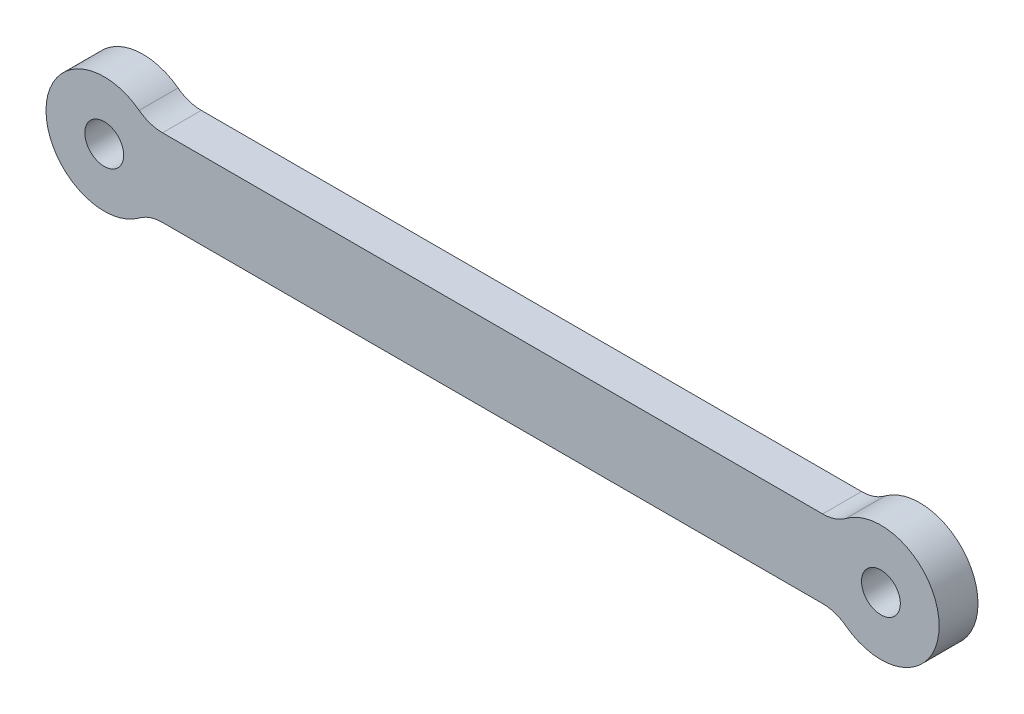
ISO-10303-21;
HEADER;
FILE_DESCRIPTION(('STEP AP214'),'2;1');
FILE_NAME('part.step','',(''),(''),'','','');
FILE_SCHEMA(('AUTOMOTIVE_DESIGN { 1 0 10303 214 1 1 1 1 }'));
ENDSEC;
DATA;
#1=APPLICATION_CONTEXT('core data for automotive mechanical design processes');
#2=APPLICATION_PROTOCOL_DEFINITION('international standard','automotive_design',2000,#1);
#3=PRODUCT_CONTEXT('',#1,'mechanical');
#4=PRODUCT('Part','Part','',(#3));
#5=PRODUCT_RELATED_PRODUCT_CATEGORY('part','',(#4));
#6=PRODUCT_DEFINITION_FORMATION('','',#4);
#7=PRODUCT_DEFINITION_CONTEXT('part definition',#1,'design');
#8=PRODUCT_DEFINITION('design','',#6,#7);
#9=PRODUCT_DEFINITION_SHAPE('','',#8);
#10=(LENGTH_UNIT() NAMED_UNIT(*) SI_UNIT(.MILLI.,.METRE.));
#11=(NAMED_UNIT(*) PLANE_ANGLE_UNIT() SI_UNIT($,.RADIAN.));
#12=(NAMED_UNIT(*) SI_UNIT($,.STERADIAN.) SOLID_ANGLE_UNIT());
#13=UNCERTAINTY_MEASURE_WITH_UNIT(LENGTH_MEASURE(1.E-05),#10,'distance_accuracy_value','');
#14=(GEOMETRIC_REPRESENTATION_CONTEXT(3) GLOBAL_UNCERTAINTY_ASSIGNED_CONTEXT((#13)) GLOBAL_UNIT_ASSIGNED_CONTEXT((#10,
#11,#12)) REPRESENTATION_CONTEXT('',''));
#15=CARTESIAN_POINT('',(0.,0.,0.));
#16=DIRECTION('',(0.,0.,1.));
#17=DIRECTION('',(1.,0.,0.));
#18=AXIS2_PLACEMENT_3D('',#15,#16,#17);
#19=CARTESIAN_POINT('',(-117.475,-12.7,3.175));
#20=DIRECTION('',(0.,0.,1.));
#21=DIRECTION('',(1.,0.,0.));
#22=AXIS2_PLACEMENT_3D('',#19,#20,#21);
#23=PLANE('',#22);
#24=CARTESIAN_POINT('',(0.,0.,3.175));
#25=DIRECTION('',(0.,0.,1.));
#26=DIRECTION('',(1.,0.,0.));
#27=AXIS2_PLACEMENT_3D('',#24,#25,#26);
#28=CIRCLE('',#27,3.175);
#29=CARTESIAN_POINT('',(3.175,0.,3.175));
#30=VERTEX_POINT('',#29);
#31=EDGE_CURVE('E134',#30,#30,#28,.T.);
#32=ORIENTED_EDGE('',*,*,#31,.F.);
#33=EDGE_LOOP('',(#32));
#34=FACE_BOUND('',#33,.T.);
#35=CARTESIAN_POINT('',(-117.475,-12.7,3.175));
#36=DIRECTION('',(0.,0.,-1.));
#37=DIRECTION('',(1.,0.,0.));
#38=AXIS2_PLACEMENT_3D('',#35,#36,#37);
#39=CIRCLE('',#38,6.35);
#40=CARTESIAN_POINT('',(-121.285,-7.62,3.175));
#41=VERTEX_POINT('',#40);
#42=CARTESIAN_POINT('',(-117.475,-6.35,3.175));
#43=VERTEX_POINT('',#42);
#44=EDGE_CURVE('E145',#41,#43,#39,.T.);
#45=ORIENTED_EDGE('',*,*,#44,.T.);
#46=DIRECTION('',(1.,0.,0.));
#47=VECTOR('',#46,1.);
#48=CARTESIAN_POINT('',(-9.525,-6.35,3.175));
#49=LINE('',#48,#47);
#50=CARTESIAN_POINT('',(-9.525,-6.35,3.175));
#51=VERTEX_POINT('',#50);
#52=EDGE_CURVE('E93',#43,#51,#49,.T.);
#53=ORIENTED_EDGE('',*,*,#52,.T.);
#54=CARTESIAN_POINT('',(-9.525,-12.7,3.175));
#55=DIRECTION('',(0.,0.,-1.));
#56=DIRECTION('',(-1.,0.,0.));
#57=AXIS2_PLACEMENT_3D('',#54,#55,#56);
#58=CIRCLE('',#57,6.35);
#59=CARTESIAN_POINT('',(-5.715,-7.62,3.175));
#60=VERTEX_POINT('',#59);
#61=EDGE_CURVE('E160',#51,#60,#58,.T.);
#62=ORIENTED_EDGE('',*,*,#61,.T.);
#63=CARTESIAN_POINT('',(0.,0.,3.175));
#64=DIRECTION('',(0.,0.,1.));
#65=DIRECTION('',(1.,0.,0.));
#66=AXIS2_PLACEMENT_3D('',#63,#64,#65);
#67=CIRCLE('',#66,9.525);
#68=CARTESIAN_POINT('',(-5.715,7.62,3.175));
#69=VERTEX_POINT('',#68);
#70=EDGE_CURVE('E173',#60,#69,#67,.T.);
#71=ORIENTED_EDGE('',*,*,#70,.T.);
#72=CARTESIAN_POINT('',(-9.525,12.7,3.175));
#73=DIRECTION('',(0.,0.,-1.));
#74=DIRECTION('',(1.,0.,0.));
#75=AXIS2_PLACEMENT_3D('',#72,#73,#74);
#76=CIRCLE('',#75,6.35);
#77=CARTESIAN_POINT('',(-9.525,6.35,3.175));
#78=VERTEX_POINT('',#77);
#79=EDGE_CURVE('E112',#69,#78,#76,.T.);
#80=ORIENTED_EDGE('',*,*,#79,.T.);
#81=DIRECTION('',(-1.,0.,0.));
#82=VECTOR('',#81,1.);
#83=CARTESIAN_POINT('',(-117.475,6.35,3.175));
#84=LINE('',#83,#82);
#85=CARTESIAN_POINT('',(-117.475,6.35,3.175));
#86=VERTEX_POINT('',#85);
#87=EDGE_CURVE('E106',#78,#86,#84,.T.);
#88=ORIENTED_EDGE('',*,*,#87,.T.);
#89=CARTESIAN_POINT('',(-117.475,12.7,3.175));
#90=DIRECTION('',(0.,0.,-1.));
#91=DIRECTION('',(-1.,0.,0.));
#92=AXIS2_PLACEMENT_3D('',#89,#90,#91);
#93=CIRCLE('',#92,6.35);
#94=CARTESIAN_POINT('',(-121.285,7.62,3.175));
#95=VERTEX_POINT('',#94);
#96=EDGE_CURVE('E110',#86,#95,#93,.T.);
#97=ORIENTED_EDGE('',*,*,#96,.T.);
#98=CARTESIAN_POINT('',(-127.,0.,3.175));
#99=DIRECTION('',(0.,0.,1.));
#100=DIRECTION('',(1.,0.,0.));
#101=AXIS2_PLACEMENT_3D('',#98,#99,#100);
#102=CIRCLE('',#101,9.525);
#103=EDGE_CURVE('E50',#95,#41,#102,.T.);
#104=ORIENTED_EDGE('',*,*,#103,.T.);
#105=EDGE_LOOP('',(#45,#53,#62,#71,#80,#88,#97,#104));
#106=FACE_BOUND('',#105,.T.);
#107=CARTESIAN_POINT('',(-127.,0.,3.175));
#108=DIRECTION('',(0.,0.,1.));
#109=DIRECTION('',(1.,0.,0.));
#110=AXIS2_PLACEMENT_3D('',#107,#108,#109);
#111=CIRCLE('',#110,3.175);
#112=CARTESIAN_POINT('',(-123.825,0.,3.175));
#113=VERTEX_POINT('',#112);
#114=EDGE_CURVE('E182',#113,#113,#111,.T.);
#115=ORIENTED_EDGE('',*,*,#114,.F.);
#116=EDGE_LOOP('',(#115));
#117=FACE_BOUND('',#116,.T.);
#118=ADVANCED_FACE('F33',(#34,#106,#117),#23,.T.);
#119=CARTESIAN_POINT('',(-117.475,-12.7,-3.175));
#120=DIRECTION('',(0.,0.,1.));
#121=DIRECTION('',(1.,0.,0.));
#122=AXIS2_PLACEMENT_3D('',#119,#120,#121);
#123=PLANE('',#122);
#124=CARTESIAN_POINT('',(-117.475,-12.7,-3.175));
#125=DIRECTION('',(0.,0.,-1.));
#126=DIRECTION('',(1.,0.,0.));
#127=AXIS2_PLACEMENT_3D('',#124,#125,#126);
#128=CIRCLE('',#127,6.35);
#129=CARTESIAN_POINT('',(-121.285,-7.62,-3.175));
#130=VERTEX_POINT('',#129);
#131=CARTESIAN_POINT('',(-117.475,-6.35,-3.175));
#132=VERTEX_POINT('',#131);
#133=EDGE_CURVE('E130',#130,#132,#128,.T.);
#134=ORIENTED_EDGE('',*,*,#133,.F.);
#135=CARTESIAN_POINT('',(-127.,0.,-3.175));
#136=DIRECTION('',(0.,0.,1.));
#137=DIRECTION('',(1.,0.,0.));
#138=AXIS2_PLACEMENT_3D('',#135,#136,#137);
#139=CIRCLE('',#138,9.525);
#140=CARTESIAN_POINT('',(-121.285,7.62,-3.175));
#141=VERTEX_POINT('',#140);
#142=EDGE_CURVE('E85',#141,#130,#139,.T.);
#143=ORIENTED_EDGE('',*,*,#142,.F.);
#144=CARTESIAN_POINT('',(-117.475,12.7,-3.175));
#145=DIRECTION('',(0.,0.,-1.));
#146=DIRECTION('',(-1.,0.,0.));
#147=AXIS2_PLACEMENT_3D('',#144,#145,#146);
#148=CIRCLE('',#147,6.35);
#149=CARTESIAN_POINT('',(-117.475,6.35,-3.175));
#150=VERTEX_POINT('',#149);
#151=EDGE_CURVE('E79',#150,#141,#148,.T.);
#152=ORIENTED_EDGE('',*,*,#151,.F.);
#153=DIRECTION('',(-1.,0.,0.));
#154=VECTOR('',#153,1.);
#155=CARTESIAN_POINT('',(-117.475,6.35,-3.175));
#156=LINE('',#155,#154);
#157=CARTESIAN_POINT('',(-9.525,6.35,-3.175));
#158=VERTEX_POINT('',#157);
#159=EDGE_CURVE('E120',#158,#150,#156,.T.);
#160=ORIENTED_EDGE('',*,*,#159,.F.);
#161=CARTESIAN_POINT('',(-9.525,12.7,-3.175));
#162=DIRECTION('',(0.,0.,-1.));
#163=DIRECTION('',(1.,0.,0.));
#164=AXIS2_PLACEMENT_3D('',#161,#162,#163);
#165=CIRCLE('',#164,6.35);
#166=CARTESIAN_POINT('',(-5.715,7.62,-3.175));
#167=VERTEX_POINT('',#166);
#168=EDGE_CURVE('E140',#167,#158,#165,.T.);
#169=ORIENTED_EDGE('',*,*,#168,.F.);
#170=CARTESIAN_POINT('',(0.,0.,-3.175));
#171=DIRECTION('',(0.,0.,1.));
#172=DIRECTION('',(1.,0.,0.));
#173=AXIS2_PLACEMENT_3D('',#170,#171,#172);
#174=CIRCLE('',#173,9.525);
#175=CARTESIAN_POINT('',(-5.715,-7.62,-3.175));
#176=VERTEX_POINT('',#175);
#177=EDGE_CURVE('E138',#176,#167,#174,.T.);
#178=ORIENTED_EDGE('',*,*,#177,.F.);
#179=CARTESIAN_POINT('',(-9.525,-12.7,-3.175));
#180=DIRECTION('',(0.,0.,-1.));
#181=DIRECTION('',(-1.,0.,0.));
#182=AXIS2_PLACEMENT_3D('',#179,#180,#181);
#183=CIRCLE('',#182,6.35);
#184=CARTESIAN_POINT('',(-9.525,-6.35,-3.175));
#185=VERTEX_POINT('',#184);
#186=EDGE_CURVE('E136',#185,#176,#183,.T.);
#187=ORIENTED_EDGE('',*,*,#186,.F.);
#188=DIRECTION('',(1.,0.,0.));
#189=VECTOR('',#188,1.);
#190=CARTESIAN_POINT('',(-9.525,-6.35,-3.175));
#191=LINE('',#190,#189);
#192=EDGE_CURVE('E133',#132,#185,#191,.T.);
#193=ORIENTED_EDGE('',*,*,#192,.F.);
#194=EDGE_LOOP('',(#134,#143,#152,#160,#169,#178,#187,#193));
#195=FACE_BOUND('',#194,.T.);
#196=CARTESIAN_POINT('',(0.,0.,-3.175));
#197=DIRECTION('',(0.,0.,1.));
#198=DIRECTION('',(1.,0.,0.));
#199=AXIS2_PLACEMENT_3D('',#196,#197,#198);
#200=CIRCLE('',#199,3.175);
#201=CARTESIAN_POINT('',(3.175,0.,-3.175));
#202=VERTEX_POINT('',#201);
#203=EDGE_CURVE('E179',#202,#202,#200,.T.);
#204=ORIENTED_EDGE('',*,*,#203,.T.);
#205=EDGE_LOOP('',(#204));
#206=FACE_BOUND('',#205,.T.);
#207=CARTESIAN_POINT('',(-127.,0.,-3.175));
#208=DIRECTION('',(0.,0.,1.));
#209=DIRECTION('',(1.,0.,0.));
#210=AXIS2_PLACEMENT_3D('',#207,#208,#209);
#211=CIRCLE('',#210,3.175);
#212=CARTESIAN_POINT('',(-123.825,0.,-3.175));
#213=VERTEX_POINT('',#212);
#214=EDGE_CURVE('E185',#213,#213,#211,.T.);
#215=ORIENTED_EDGE('',*,*,#214,.T.);
#216=EDGE_LOOP('',(#215));
#217=FACE_BOUND('',#216,.T.);
#218=ADVANCED_FACE('F164',(#195,#206,#217),#123,.F.);
#219=CARTESIAN_POINT('',(-117.475,-12.7,3.175));
#220=DIRECTION('',(0.,0.,-1.));
#221=DIRECTION('',(-1.,0.,0.));
#222=AXIS2_PLACEMENT_3D('',#219,#220,#221);
#223=CYLINDRICAL_SURFACE('',#222,6.35);
#224=ORIENTED_EDGE('',*,*,#133,.T.);
#225=DIRECTION('',(0.,0.,-1.));
#226=VECTOR('',#225,1.);
#227=CARTESIAN_POINT('',(-117.475,-6.35,3.175));
#228=LINE('',#227,#226);
#229=EDGE_CURVE('E11',#43,#132,#228,.T.);
#230=ORIENTED_EDGE('',*,*,#229,.F.);
#231=ORIENTED_EDGE('',*,*,#44,.F.);
#232=DIRECTION('',(0.,0.,-1.));
#233=VECTOR('',#232,1.);
#234=CARTESIAN_POINT('',(-121.285,-7.62,3.175));
#235=LINE('',#234,#233);
#236=EDGE_CURVE('E126',#41,#130,#235,.T.);
#237=ORIENTED_EDGE('',*,*,#236,.T.);
#238=EDGE_LOOP('',(#224,#230,#231,#237));
#239=FACE_BOUND('',#238,.T.);
#240=ADVANCED_FACE('F35',(#239),#223,.F.);
#241=CARTESIAN_POINT('',(-9.525,-6.35,3.175));
#242=DIRECTION('',(0.,1.,0.));
#243=DIRECTION('',(-1.,0.,0.));
#244=AXIS2_PLACEMENT_3D('',#241,#242,#243);
#245=PLANE('',#244);
#246=ORIENTED_EDGE('',*,*,#192,.T.);
#247=DIRECTION('',(0.,0.,-1.));
#248=VECTOR('',#247,1.);
#249=CARTESIAN_POINT('',(-9.525,-6.35,3.175));
#250=LINE('',#249,#248);
#251=EDGE_CURVE('E42',#51,#185,#250,.T.);
#252=ORIENTED_EDGE('',*,*,#251,.F.);
#253=ORIENTED_EDGE('',*,*,#52,.F.);
#254=ORIENTED_EDGE('',*,*,#229,.T.);
#255=EDGE_LOOP('',(#246,#252,#253,#254));
#256=FACE_BOUND('',#255,.T.);
#257=ADVANCED_FACE('F217',(#256),#245,.F.);
#258=CARTESIAN_POINT('',(-9.525,-12.7,3.175));
#259=DIRECTION('',(0.,0.,-1.));
#260=DIRECTION('',(-1.,0.,0.));
#261=AXIS2_PLACEMENT_3D('',#258,#259,#260);
#262=CYLINDRICAL_SURFACE('',#261,6.35);
#263=ORIENTED_EDGE('',*,*,#186,.T.);
#264=DIRECTION('',(0.,0.,-1.));
#265=VECTOR('',#264,1.);
#266=CARTESIAN_POINT('',(-5.715,-7.62,3.175));
#267=LINE('',#266,#265);
#268=EDGE_CURVE('E152',#60,#176,#267,.T.);
#269=ORIENTED_EDGE('',*,*,#268,.F.);
#270=ORIENTED_EDGE('',*,*,#61,.F.);
#271=ORIENTED_EDGE('',*,*,#251,.T.);
#272=EDGE_LOOP('',(#263,#269,#270,#271));
#273=FACE_BOUND('',#272,.T.);
#274=ADVANCED_FACE('F158',(#273),#262,.F.);
#275=CARTESIAN_POINT('',(0.,0.,3.175));
#276=DIRECTION('',(0.,0.,-1.));
#277=DIRECTION('',(-1.,0.,0.));
#278=AXIS2_PLACEMENT_3D('',#275,#276,#277);
#279=CYLINDRICAL_SURFACE('',#278,9.525);
#280=ORIENTED_EDGE('',*,*,#177,.T.);
#281=DIRECTION('',(0.,0.,-1.));
#282=VECTOR('',#281,1.);
#283=CARTESIAN_POINT('',(-5.715,7.62,3.175));
#284=LINE('',#283,#282);
#285=EDGE_CURVE('E149',#69,#167,#284,.T.);
#286=ORIENTED_EDGE('',*,*,#285,.F.);
#287=ORIENTED_EDGE('',*,*,#70,.F.);
#288=ORIENTED_EDGE('',*,*,#268,.T.);
#289=EDGE_LOOP('',(#280,#286,#287,#288));
#290=FACE_BOUND('',#289,.T.);
#291=ADVANCED_FACE('F169',(#290),#279,.T.);
#292=CARTESIAN_POINT('',(-9.525,12.7,3.175));
#293=DIRECTION('',(0.,0.,-1.));
#294=DIRECTION('',(-1.,0.,0.));
#295=AXIS2_PLACEMENT_3D('',#292,#293,#294);
#296=CYLINDRICAL_SURFACE('',#295,6.35);
#297=ORIENTED_EDGE('',*,*,#168,.T.);
#298=DIRECTION('',(0.,0.,-1.));
#299=VECTOR('',#298,1.);
#300=CARTESIAN_POINT('',(-9.525,6.35,3.175));
#301=LINE('',#300,#299);
#302=EDGE_CURVE('E121',#78,#158,#301,.T.);
#303=ORIENTED_EDGE('',*,*,#302,.F.);
#304=ORIENTED_EDGE('',*,*,#79,.F.);
#305=ORIENTED_EDGE('',*,*,#285,.T.);
#306=EDGE_LOOP('',(#297,#303,#304,#305));
#307=FACE_BOUND('',#306,.T.);
#308=ADVANCED_FACE('F172',(#307),#296,.F.);
#309=CARTESIAN_POINT('',(-117.475,6.35,3.175));
#310=DIRECTION('',(0.,-1.,0.));
#311=DIRECTION('',(1.,0.,0.));
#312=AXIS2_PLACEMENT_3D('',#309,#310,#311);
#313=PLANE('',#312);
#314=ORIENTED_EDGE('',*,*,#159,.T.);
#315=DIRECTION('',(0.,0.,-1.));
#316=VECTOR('',#315,1.);
#317=CARTESIAN_POINT('',(-117.475,6.35,3.175));
#318=LINE('',#317,#316);
#319=EDGE_CURVE('E117',#86,#150,#318,.T.);
#320=ORIENTED_EDGE('',*,*,#319,.F.);
#321=ORIENTED_EDGE('',*,*,#87,.F.);
#322=ORIENTED_EDGE('',*,*,#302,.T.);
#323=EDGE_LOOP('',(#314,#320,#321,#322));
#324=FACE_BOUND('',#323,.T.);
#325=ADVANCED_FACE('F118',(#324),#313,.F.);
#326=CARTESIAN_POINT('',(-117.475,12.7,3.175));
#327=DIRECTION('',(0.,0.,-1.));
#328=DIRECTION('',(-1.,0.,0.));
#329=AXIS2_PLACEMENT_3D('',#326,#327,#328);
#330=CYLINDRICAL_SURFACE('',#329,6.35);
#331=ORIENTED_EDGE('',*,*,#151,.T.);
#332=DIRECTION('',(0.,0.,-1.));
#333=VECTOR('',#332,1.);
#334=CARTESIAN_POINT('',(-121.285,7.62,3.175));
#335=LINE('',#334,#333);
#336=EDGE_CURVE('E122',#95,#141,#335,.T.);
#337=ORIENTED_EDGE('',*,*,#336,.F.);
#338=ORIENTED_EDGE('',*,*,#96,.F.);
#339=ORIENTED_EDGE('',*,*,#319,.T.);
#340=EDGE_LOOP('',(#331,#337,#338,#339));
#341=FACE_BOUND('',#340,.T.);
#342=ADVANCED_FACE('F124',(#341),#330,.F.);
#343=CARTESIAN_POINT('',(-127.,0.,3.175));
#344=DIRECTION('',(0.,0.,-1.));
#345=DIRECTION('',(-1.,0.,0.));
#346=AXIS2_PLACEMENT_3D('',#343,#344,#345);
#347=CYLINDRICAL_SURFACE('',#346,9.525);
#348=ORIENTED_EDGE('',*,*,#142,.T.);
#349=ORIENTED_EDGE('',*,*,#236,.F.);
#350=ORIENTED_EDGE('',*,*,#103,.F.);
#351=ORIENTED_EDGE('',*,*,#336,.T.);
#352=EDGE_LOOP('',(#348,#349,#350,#351));
#353=FACE_BOUND('',#352,.T.);
#354=ADVANCED_FACE('F205',(#353),#347,.T.);
#355=CARTESIAN_POINT('',(0.,0.,3.175));
#356=DIRECTION('',(0.,0.,-1.));
#357=DIRECTION('',(-1.,0.,0.));
#358=AXIS2_PLACEMENT_3D('',#355,#356,#357);
#359=CYLINDRICAL_SURFACE('',#358,3.175);
#360=ORIENTED_EDGE('',*,*,#31,.T.);
#361=EDGE_LOOP('',(#360));
#362=FACE_BOUND('',#361,.T.);
#363=ORIENTED_EDGE('',*,*,#203,.F.);
#364=EDGE_LOOP('',(#363));
#365=FACE_BOUND('',#364,.T.);
#366=ADVANCED_FACE('F202',(#362,#365),#359,.F.);
#367=CARTESIAN_POINT('',(-127.,0.,3.175));
#368=DIRECTION('',(0.,0.,-1.));
#369=DIRECTION('',(-1.,0.,0.));
#370=AXIS2_PLACEMENT_3D('',#367,#368,#369);
#371=CYLINDRICAL_SURFACE('',#370,3.175);
#372=ORIENTED_EDGE('',*,*,#114,.T.);
#373=EDGE_LOOP('',(#372));
#374=FACE_BOUND('',#373,.T.);
#375=ORIENTED_EDGE('',*,*,#214,.F.);
#376=EDGE_LOOP('',(#375));
#377=FACE_BOUND('',#376,.T.);
#378=ADVANCED_FACE('F191',(#374,#377),#371,.F.);
#379=CLOSED_SHELL('',(#118,#218,#240,#257,#274,#291,#308,#325,#342,#354,#366,#378));
#380=MANIFOLD_SOLID_BREP('B2',#379);
#381=ADVANCED_BREP_SHAPE_REPRESENTATION('',(#18,#380),#14);
#382=SHAPE_DEFINITION_REPRESENTATION(#9,#381);
ENDSEC;
END-ISO-10303-21;
